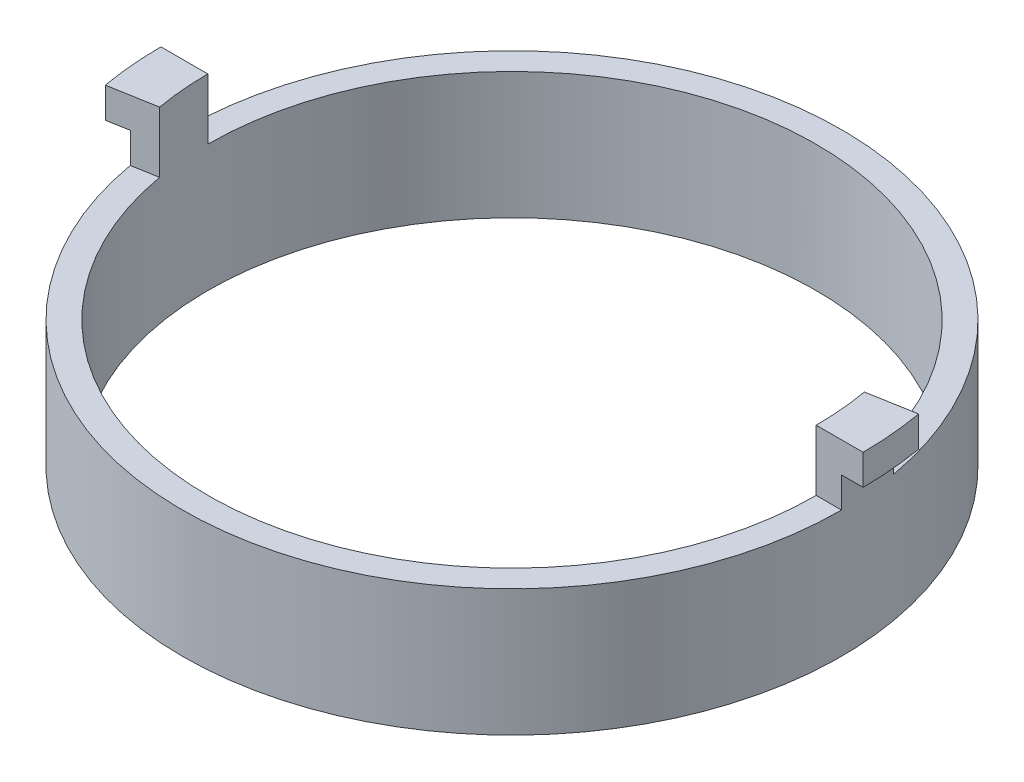
ISO-10303-21;
HEADER;
FILE_DESCRIPTION(('STEP AP214'),'2;1');
FILE_NAME('part.step','',(''),(''),'','','');
FILE_SCHEMA(('AUTOMOTIVE_DESIGN { 1 0 10303 214 1 1 1 1 }'));
ENDSEC;
DATA;
#1=APPLICATION_CONTEXT('core data for automotive mechanical design processes');
#2=APPLICATION_PROTOCOL_DEFINITION('international standard','automotive_design',2000,#1);
#3=PRODUCT_CONTEXT('',#1,'mechanical');
#4=PRODUCT('Part','Part','',(#3));
#5=PRODUCT_RELATED_PRODUCT_CATEGORY('part','',(#4));
#6=PRODUCT_DEFINITION_FORMATION('','',#4);
#7=PRODUCT_DEFINITION_CONTEXT('part definition',#1,'design');
#8=PRODUCT_DEFINITION('design','',#6,#7);
#9=PRODUCT_DEFINITION_SHAPE('','',#8);
#10=(LENGTH_UNIT() NAMED_UNIT(*) SI_UNIT(.MILLI.,.METRE.));
#11=(NAMED_UNIT(*) PLANE_ANGLE_UNIT() SI_UNIT($,.RADIAN.));
#12=(NAMED_UNIT(*) SI_UNIT($,.STERADIAN.) SOLID_ANGLE_UNIT());
#13=UNCERTAINTY_MEASURE_WITH_UNIT(LENGTH_MEASURE(1.E-05),#10,'distance_accuracy_value','');
#14=(GEOMETRIC_REPRESENTATION_CONTEXT(3) GLOBAL_UNCERTAINTY_ASSIGNED_CONTEXT((#13)) GLOBAL_UNIT_ASSIGNED_CONTEXT((#10,
#11,#12)) REPRESENTATION_CONTEXT('',''));
#15=CARTESIAN_POINT('',(0.,0.,0.));
#16=DIRECTION('',(0.,0.,1.));
#17=DIRECTION('',(1.,0.,0.));
#18=AXIS2_PLACEMENT_3D('',#15,#16,#17);
#19=CARTESIAN_POINT('',(0.,5.,0.));
#20=DIRECTION('',(0.,1.,0.));
#21=DIRECTION('',(0.,0.,1.));
#22=AXIS2_PLACEMENT_3D('',#19,#20,#21);
#23=PLANE('',#22);
#24=CARTESIAN_POINT('',(0.,5.,0.));
#25=DIRECTION('',(0.,1.,0.));
#26=DIRECTION('',(0.,0.,1.));
#27=AXIS2_PLACEMENT_3D('',#24,#25,#26);
#28=CIRCLE('',#27,12.);
#29=CARTESIAN_POINT('',(11.8176930361465,5.,-2.08377813200317));
#30=VERTEX_POINT('',#29);
#31=CARTESIAN_POINT('',(-12.,5.,0.));
#32=VERTEX_POINT('',#31);
#33=EDGE_CURVE('E59',#30,#32,#28,.T.);
#34=ORIENTED_EDGE('',*,*,#33,.F.);
#35=DIRECTION('',(-0.984807753012208,0.,0.173648177666931));
#36=VECTOR('',#35,1.);
#37=CARTESIAN_POINT('',(0.,5.,0.));
#38=LINE('',#37,#36);
#39=CARTESIAN_POINT('',(12.8025007891587,5.,-2.2574263096701));
#40=VERTEX_POINT('',#39);
#41=EDGE_CURVE('E206',#40,#30,#38,.T.);
#42=ORIENTED_EDGE('',*,*,#41,.F.);
#43=CARTESIAN_POINT('',(0.,5.,0.));
#44=DIRECTION('',(0.,1.,0.));
#45=DIRECTION('',(0.,0.,1.));
#46=AXIS2_PLACEMENT_3D('',#43,#44,#45);
#47=CIRCLE('',#46,13.);
#48=CARTESIAN_POINT('',(-13.,5.,0.));
#49=VERTEX_POINT('',#48);
#50=EDGE_CURVE('E47',#40,#49,#47,.T.);
#51=ORIENTED_EDGE('',*,*,#50,.T.);
#52=DIRECTION('',(1.,0.,0.));
#53=VECTOR('',#52,1.);
#54=CARTESIAN_POINT('',(0.,5.,0.));
#55=LINE('',#54,#53);
#56=EDGE_CURVE('E205',#49,#32,#55,.T.);
#57=ORIENTED_EDGE('',*,*,#56,.T.);
#58=EDGE_LOOP('',(#34,#42,#51,#57));
#59=FACE_BOUND('',#58,.T.);
#60=ADVANCED_FACE('F38',(#59),#23,.T.);
#61=DIRECTION('',(-1.,0.,0.));
#62=VECTOR('',#61,1.);
#63=CARTESIAN_POINT('',(0.,5.,0.));
#64=LINE('',#63,#62);
#65=CARTESIAN_POINT('',(13.,5.,0.));
#66=VERTEX_POINT('',#65);
#67=CARTESIAN_POINT('',(12.,5.,0.));
#68=VERTEX_POINT('',#67);
#69=EDGE_CURVE('E128',#66,#68,#64,.T.);
#70=ORIENTED_EDGE('',*,*,#69,.T.);
#71=CARTESIAN_POINT('',(-11.8176930361465,5.,2.08377813200317));
#72=VERTEX_POINT('',#71);
#73=EDGE_CURVE('E153',#72,#68,#28,.T.);
#74=ORIENTED_EDGE('',*,*,#73,.F.);
#75=DIRECTION('',(0.984807753012208,0.,-0.173648177666931));
#76=VECTOR('',#75,1.);
#77=CARTESIAN_POINT('',(0.,5.,0.));
#78=LINE('',#77,#76);
#79=CARTESIAN_POINT('',(-12.8025007891587,5.,2.2574263096701));
#80=VERTEX_POINT('',#79);
#81=EDGE_CURVE('E152',#80,#72,#78,.T.);
#82=ORIENTED_EDGE('',*,*,#81,.F.);
#83=EDGE_CURVE('E11',#80,#66,#47,.T.);
#84=ORIENTED_EDGE('',*,*,#83,.T.);
#85=EDGE_LOOP('',(#70,#74,#82,#84));
#86=FACE_BOUND('',#85,.T.);
#87=ADVANCED_FACE('F150',(#86),#23,.T.);
#88=CARTESIAN_POINT('',(0.,0.,0.));
#89=DIRECTION('',(0.,1.,0.));
#90=DIRECTION('',(0.,0.,1.));
#91=AXIS2_PLACEMENT_3D('',#88,#89,#90);
#92=PLANE('',#91);
#93=CARTESIAN_POINT('',(0.,0.,0.));
#94=DIRECTION('',(0.,1.,0.));
#95=DIRECTION('',(0.,0.,1.));
#96=AXIS2_PLACEMENT_3D('',#93,#94,#95);
#97=CIRCLE('',#96,13.);
#98=CARTESIAN_POINT('',(0.,0.,13.));
#99=VERTEX_POINT('',#98);
#100=EDGE_CURVE('E42',#99,#99,#97,.T.);
#101=ORIENTED_EDGE('',*,*,#100,.F.);
#102=EDGE_LOOP('',(#101));
#103=FACE_BOUND('',#102,.T.);
#104=CARTESIAN_POINT('',(0.,0.,0.));
#105=DIRECTION('',(0.,1.,0.));
#106=DIRECTION('',(0.,0.,1.));
#107=AXIS2_PLACEMENT_3D('',#104,#105,#106);
#108=CIRCLE('',#107,12.);
#109=CARTESIAN_POINT('',(0.,0.,12.));
#110=VERTEX_POINT('',#109);
#111=EDGE_CURVE('E170',#110,#110,#108,.T.);
#112=ORIENTED_EDGE('',*,*,#111,.T.);
#113=EDGE_LOOP('',(#112));
#114=FACE_BOUND('',#113,.T.);
#115=ADVANCED_FACE('F175',(#103,#114),#92,.F.);
#116=CARTESIAN_POINT('',(0.,5.,0.));
#117=DIRECTION('',(0.,-1.,0.));
#118=DIRECTION('',(0.,0.,-1.));
#119=AXIS2_PLACEMENT_3D('',#116,#117,#118);
#120=CYLINDRICAL_SURFACE('',#119,13.);
#121=ORIENTED_EDGE('',*,*,#83,.F.);
#122=DIRECTION('',(0.,-1.,0.));
#123=VECTOR('',#122,1.);
#124=CARTESIAN_POINT('',(-12.8025007891587,0.,2.2574263096701));
#125=LINE('',#124,#123);
#126=CARTESIAN_POINT('',(-12.8025007891587,6.2,2.2574263096701));
#127=VERTEX_POINT('',#126);
#128=EDGE_CURVE('E157',#127,#80,#125,.T.);
#129=ORIENTED_EDGE('',*,*,#128,.F.);
#130=CARTESIAN_POINT('',(0.,6.2,0.));
#131=DIRECTION('',(0.,-1.,0.));
#132=DIRECTION('',(0.,0.,-1.));
#133=AXIS2_PLACEMENT_3D('',#130,#131,#132);
#134=CIRCLE('',#133,13.);
#135=CARTESIAN_POINT('',(-13.,6.2,0.));
#136=VERTEX_POINT('',#135);
#137=EDGE_CURVE('E156',#127,#136,#134,.T.);
#138=ORIENTED_EDGE('',*,*,#137,.T.);
#139=DIRECTION('',(0.,-1.,0.));
#140=VECTOR('',#139,1.);
#141=CARTESIAN_POINT('',(-13.,0.,0.));
#142=LINE('',#141,#140);
#143=EDGE_CURVE('E208',#136,#49,#142,.T.);
#144=ORIENTED_EDGE('',*,*,#143,.T.);
#145=ORIENTED_EDGE('',*,*,#50,.F.);
#146=DIRECTION('',(0.,-1.,0.));
#147=VECTOR('',#146,1.);
#148=CARTESIAN_POINT('',(12.8025007891587,0.,-2.2574263096701));
#149=LINE('',#148,#147);
#150=CARTESIAN_POINT('',(12.8025007891587,6.2,-2.2574263096701));
#151=VERTEX_POINT('',#150);
#152=EDGE_CURVE('E259',#151,#40,#149,.T.);
#153=ORIENTED_EDGE('',*,*,#152,.F.);
#154=CARTESIAN_POINT('',(0.,6.2,0.));
#155=DIRECTION('',(0.,-1.,0.));
#156=DIRECTION('',(0.,0.,-1.));
#157=AXIS2_PLACEMENT_3D('',#154,#155,#156);
#158=CIRCLE('',#157,13.);
#159=CARTESIAN_POINT('',(13.,6.2,0.));
#160=VERTEX_POINT('',#159);
#161=EDGE_CURVE('E146',#151,#160,#158,.T.);
#162=ORIENTED_EDGE('',*,*,#161,.T.);
#163=DIRECTION('',(0.,-1.,0.));
#164=VECTOR('',#163,1.);
#165=CARTESIAN_POINT('',(13.,0.,0.));
#166=LINE('',#165,#164);
#167=EDGE_CURVE('E132',#160,#66,#166,.T.);
#168=ORIENTED_EDGE('',*,*,#167,.T.);
#169=EDGE_LOOP('',(#121,#129,#138,#144,#145,#153,#162,#168));
#170=FACE_BOUND('',#169,.T.);
#171=ORIENTED_EDGE('',*,*,#100,.T.);
#172=EDGE_LOOP('',(#171));
#173=FACE_BOUND('',#172,.T.);
#174=ADVANCED_FACE('F40',(#170,#173),#120,.T.);
#175=CARTESIAN_POINT('',(0.,5.,0.));
#176=DIRECTION('',(0.,-1.,0.));
#177=DIRECTION('',(0.,0.,-1.));
#178=AXIS2_PLACEMENT_3D('',#175,#176,#177);
#179=CYLINDRICAL_SURFACE('',#178,12.);
#180=ORIENTED_EDGE('',*,*,#73,.T.);
#181=DIRECTION('',(0.,1.,0.));
#182=VECTOR('',#181,1.);
#183=CARTESIAN_POINT('',(12.,0.,0.));
#184=LINE('',#183,#182);
#185=CARTESIAN_POINT('',(12.,7.4,0.));
#186=VERTEX_POINT('',#185);
#187=EDGE_CURVE('E136',#68,#186,#184,.T.);
#188=ORIENTED_EDGE('',*,*,#187,.T.);
#189=CARTESIAN_POINT('',(0.,7.4,0.));
#190=DIRECTION('',(0.,-1.,0.));
#191=DIRECTION('',(0.,0.,-1.));
#192=AXIS2_PLACEMENT_3D('',#189,#190,#191);
#193=CIRCLE('',#192,12.);
#194=CARTESIAN_POINT('',(11.8176930361465,7.4,-2.08377813200317));
#195=VERTEX_POINT('',#194);
#196=EDGE_CURVE('E247',#195,#186,#193,.T.);
#197=ORIENTED_EDGE('',*,*,#196,.F.);
#198=DIRECTION('',(0.,1.,0.));
#199=VECTOR('',#198,1.);
#200=CARTESIAN_POINT('',(11.8176930361465,0.,-2.08377813200317));
#201=LINE('',#200,#199);
#202=EDGE_CURVE('E54',#30,#195,#201,.T.);
#203=ORIENTED_EDGE('',*,*,#202,.F.);
#204=ORIENTED_EDGE('',*,*,#33,.T.);
#205=DIRECTION('',(0.,1.,0.));
#206=VECTOR('',#205,1.);
#207=CARTESIAN_POINT('',(-12.,0.,0.));
#208=LINE('',#207,#206);
#209=CARTESIAN_POINT('',(-12.,7.4,0.));
#210=VERTEX_POINT('',#209);
#211=EDGE_CURVE('E216',#32,#210,#208,.T.);
#212=ORIENTED_EDGE('',*,*,#211,.T.);
#213=CARTESIAN_POINT('',(0.,7.4,0.));
#214=DIRECTION('',(0.,-1.,0.));
#215=DIRECTION('',(0.,0.,-1.));
#216=AXIS2_PLACEMENT_3D('',#213,#214,#215);
#217=CIRCLE('',#216,12.);
#218=CARTESIAN_POINT('',(-11.8176930361465,7.4,2.08377813200317));
#219=VERTEX_POINT('',#218);
#220=EDGE_CURVE('E168',#219,#210,#217,.T.);
#221=ORIENTED_EDGE('',*,*,#220,.F.);
#222=DIRECTION('',(0.,1.,0.));
#223=VECTOR('',#222,1.);
#224=CARTESIAN_POINT('',(-11.8176930361465,0.,2.08377813200317));
#225=LINE('',#224,#223);
#226=EDGE_CURVE('E217',#72,#219,#225,.T.);
#227=ORIENTED_EDGE('',*,*,#226,.F.);
#228=EDGE_LOOP('',(#180,#188,#197,#203,#204,#212,#221,#227));
#229=FACE_BOUND('',#228,.T.);
#230=ORIENTED_EDGE('',*,*,#111,.F.);
#231=EDGE_LOOP('',(#230));
#232=FACE_BOUND('',#231,.T.);
#233=ADVANCED_FACE('F177',(#229,#232),#179,.F.);
#234=CARTESIAN_POINT('',(0.,7.4,0.));
#235=DIRECTION('',(0.,-1.,0.));
#236=DIRECTION('',(0.,0.,-1.));
#237=AXIS2_PLACEMENT_3D('',#234,#235,#236);
#238=PLANE('',#237);
#239=CARTESIAN_POINT('',(0.,7.4,0.));
#240=DIRECTION('',(0.,-1.,0.));
#241=DIRECTION('',(0.,0.,-1.));
#242=AXIS2_PLACEMENT_3D('',#239,#240,#241);
#243=CIRCLE('',#242,13.85);
#244=CARTESIAN_POINT('',(-13.6395873792191,7.4,2.40502726068699));
#245=VERTEX_POINT('',#244);
#246=CARTESIAN_POINT('',(-13.85,7.4,0.));
#247=VERTEX_POINT('',#246);
#248=EDGE_CURVE('E166',#245,#247,#243,.T.);
#249=ORIENTED_EDGE('',*,*,#248,.F.);
#250=DIRECTION('',(-0.984807753012208,0.,0.173648177666931));
#251=VECTOR('',#250,1.);
#252=CARTESIAN_POINT('',(0.,7.4,0.));
#253=LINE('',#252,#251);
#254=EDGE_CURVE('E219',#219,#245,#253,.T.);
#255=ORIENTED_EDGE('',*,*,#254,.F.);
#256=ORIENTED_EDGE('',*,*,#220,.T.);
#257=DIRECTION('',(-1.,0.,0.));
#258=VECTOR('',#257,1.);
#259=CARTESIAN_POINT('',(0.,7.4,0.));
#260=LINE('',#259,#258);
#261=EDGE_CURVE('E236',#210,#247,#260,.T.);
#262=ORIENTED_EDGE('',*,*,#261,.T.);
#263=EDGE_LOOP('',(#249,#255,#256,#262));
#264=FACE_BOUND('',#263,.T.);
#265=ADVANCED_FACE('F179',(#264),#238,.F.);
#266=CARTESIAN_POINT('',(0.,0.,0.));
#267=DIRECTION('',(0.,-1.,0.));
#268=DIRECTION('',(0.,0.,-1.));
#269=AXIS2_PLACEMENT_3D('',#266,#267,#268);
#270=CYLINDRICAL_SURFACE('',#269,13.85);
#271=CARTESIAN_POINT('',(0.,6.2,0.));
#272=DIRECTION('',(0.,-1.,0.));
#273=DIRECTION('',(0.,0.,-1.));
#274=AXIS2_PLACEMENT_3D('',#271,#272,#273);
#275=CIRCLE('',#274,13.85);
#276=CARTESIAN_POINT('',(-13.6395873792191,6.2,2.40502726068699));
#277=VERTEX_POINT('',#276);
#278=CARTESIAN_POINT('',(-13.85,6.2,0.));
#279=VERTEX_POINT('',#278);
#280=EDGE_CURVE('E159',#277,#279,#275,.T.);
#281=ORIENTED_EDGE('',*,*,#280,.F.);
#282=DIRECTION('',(0.,-1.,0.));
#283=VECTOR('',#282,1.);
#284=CARTESIAN_POINT('',(-13.6395873792191,0.,2.40502726068699));
#285=LINE('',#284,#283);
#286=EDGE_CURVE('E225',#245,#277,#285,.T.);
#287=ORIENTED_EDGE('',*,*,#286,.F.);
#288=ORIENTED_EDGE('',*,*,#248,.T.);
#289=DIRECTION('',(0.,-1.,0.));
#290=VECTOR('',#289,1.);
#291=CARTESIAN_POINT('',(-13.85,0.,0.));
#292=LINE('',#291,#290);
#293=EDGE_CURVE('E235',#247,#279,#292,.T.);
#294=ORIENTED_EDGE('',*,*,#293,.T.);
#295=EDGE_LOOP('',(#281,#287,#288,#294));
#296=FACE_BOUND('',#295,.T.);
#297=ADVANCED_FACE('F185',(#296),#270,.T.);
#298=CARTESIAN_POINT('',(0.,6.2,0.));
#299=DIRECTION('',(0.,1.,0.));
#300=DIRECTION('',(0.,0.,1.));
#301=AXIS2_PLACEMENT_3D('',#298,#299,#300);
#302=PLANE('',#301);
#303=ORIENTED_EDGE('',*,*,#137,.F.);
#304=DIRECTION('',(0.984807753012208,0.,-0.173648177666931));
#305=VECTOR('',#304,1.);
#306=CARTESIAN_POINT('',(0.,6.2,0.));
#307=LINE('',#306,#305);
#308=EDGE_CURVE('E161',#277,#127,#307,.T.);
#309=ORIENTED_EDGE('',*,*,#308,.F.);
#310=ORIENTED_EDGE('',*,*,#280,.T.);
#311=DIRECTION('',(1.,0.,0.));
#312=VECTOR('',#311,1.);
#313=CARTESIAN_POINT('',(0.,6.2,0.));
#314=LINE('',#313,#312);
#315=EDGE_CURVE('E212',#279,#136,#314,.T.);
#316=ORIENTED_EDGE('',*,*,#315,.T.);
#317=EDGE_LOOP('',(#303,#309,#310,#316));
#318=FACE_BOUND('',#317,.T.);
#319=ADVANCED_FACE('F232',(#318),#302,.F.);
#320=CARTESIAN_POINT('',(0.,0.,0.));
#321=DIRECTION('',(0.173648177666931,0.,0.984807753012208));
#322=DIRECTION('',(0.984807753012208,0.,-0.173648177666931));
#323=AXIS2_PLACEMENT_3D('',#320,#321,#322);
#324=PLANE('',#323);
#325=ORIENTED_EDGE('',*,*,#226,.T.);
#326=ORIENTED_EDGE('',*,*,#254,.T.);
#327=ORIENTED_EDGE('',*,*,#286,.T.);
#328=ORIENTED_EDGE('',*,*,#308,.T.);
#329=ORIENTED_EDGE('',*,*,#128,.T.);
#330=ORIENTED_EDGE('',*,*,#81,.T.);
#331=EDGE_LOOP('',(#325,#326,#327,#328,#329,#330));
#332=FACE_BOUND('',#331,.T.);
#333=ADVANCED_FACE('F229',(#332),#324,.T.);
#334=CARTESIAN_POINT('',(0.,0.,0.));
#335=DIRECTION('',(0.,0.,1.));
#336=DIRECTION('',(1.,0.,0.));
#337=AXIS2_PLACEMENT_3D('',#334,#335,#336);
#338=PLANE('',#337);
#339=ORIENTED_EDGE('',*,*,#211,.F.);
#340=ORIENTED_EDGE('',*,*,#56,.F.);
#341=ORIENTED_EDGE('',*,*,#143,.F.);
#342=ORIENTED_EDGE('',*,*,#315,.F.);
#343=ORIENTED_EDGE('',*,*,#293,.F.);
#344=ORIENTED_EDGE('',*,*,#261,.F.);
#345=EDGE_LOOP('',(#339,#340,#341,#342,#343,#344));
#346=FACE_BOUND('',#345,.T.);
#347=ADVANCED_FACE('F214',(#346),#338,.F.);
#348=CARTESIAN_POINT('',(0.,6.2,0.));
#349=DIRECTION('',(0.,1.,0.));
#350=DIRECTION('',(0.,0.,1.));
#351=AXIS2_PLACEMENT_3D('',#348,#349,#350);
#352=PLANE('',#351);
#353=CARTESIAN_POINT('',(0.,6.2,0.));
#354=DIRECTION('',(0.,-1.,0.));
#355=DIRECTION('',(0.,0.,-1.));
#356=AXIS2_PLACEMENT_3D('',#353,#354,#355);
#357=CIRCLE('',#356,13.85);
#358=CARTESIAN_POINT('',(13.6395873792191,6.2,-2.40502726068699));
#359=VERTEX_POINT('',#358);
#360=CARTESIAN_POINT('',(13.85,6.2,0.));
#361=VERTEX_POINT('',#360);
#362=EDGE_CURVE('E243',#359,#361,#357,.T.);
#363=ORIENTED_EDGE('',*,*,#362,.T.);
#364=DIRECTION('',(-1.,0.,0.));
#365=VECTOR('',#364,1.);
#366=CARTESIAN_POINT('',(0.,6.2,0.));
#367=LINE('',#366,#365);
#368=EDGE_CURVE('E147',#361,#160,#367,.T.);
#369=ORIENTED_EDGE('',*,*,#368,.T.);
#370=ORIENTED_EDGE('',*,*,#161,.F.);
#371=DIRECTION('',(-0.984807753012208,0.,0.173648177666931));
#372=VECTOR('',#371,1.);
#373=CARTESIAN_POINT('',(0.,6.2,0.));
#374=LINE('',#373,#372);
#375=EDGE_CURVE('E256',#359,#151,#374,.T.);
#376=ORIENTED_EDGE('',*,*,#375,.F.);
#377=EDGE_LOOP('',(#363,#369,#370,#376));
#378=FACE_BOUND('',#377,.T.);
#379=ADVANCED_FACE('F270',(#378),#352,.F.);
#380=CARTESIAN_POINT('',(0.,0.,0.));
#381=DIRECTION('',(0.,-1.,0.));
#382=DIRECTION('',(0.,0.,-1.));
#383=AXIS2_PLACEMENT_3D('',#380,#381,#382);
#384=CYLINDRICAL_SURFACE('',#383,13.85);
#385=CARTESIAN_POINT('',(0.,7.4,0.));
#386=DIRECTION('',(0.,-1.,0.));
#387=DIRECTION('',(0.,0.,-1.));
#388=AXIS2_PLACEMENT_3D('',#385,#386,#387);
#389=CIRCLE('',#388,13.85);
#390=CARTESIAN_POINT('',(13.6395873792191,7.4,-2.40502726068699));
#391=VERTEX_POINT('',#390);
#392=CARTESIAN_POINT('',(13.85,7.4,0.));
#393=VERTEX_POINT('',#392);
#394=EDGE_CURVE('E245',#391,#393,#389,.T.);
#395=ORIENTED_EDGE('',*,*,#394,.T.);
#396=DIRECTION('',(0.,-1.,0.));
#397=VECTOR('',#396,1.);
#398=CARTESIAN_POINT('',(13.85,0.,0.));
#399=LINE('',#398,#397);
#400=EDGE_CURVE('E266',#393,#361,#399,.T.);
#401=ORIENTED_EDGE('',*,*,#400,.T.);
#402=ORIENTED_EDGE('',*,*,#362,.F.);
#403=DIRECTION('',(0.,-1.,0.));
#404=VECTOR('',#403,1.);
#405=CARTESIAN_POINT('',(13.6395873792191,0.,-2.40502726068699));
#406=LINE('',#405,#404);
#407=EDGE_CURVE('E253',#391,#359,#406,.T.);
#408=ORIENTED_EDGE('',*,*,#407,.F.);
#409=EDGE_LOOP('',(#395,#401,#402,#408));
#410=FACE_BOUND('',#409,.T.);
#411=ADVANCED_FACE('F274',(#410),#384,.T.);
#412=CARTESIAN_POINT('',(0.,7.4,0.));
#413=DIRECTION('',(0.,-1.,0.));
#414=DIRECTION('',(0.,0.,-1.));
#415=AXIS2_PLACEMENT_3D('',#412,#413,#414);
#416=PLANE('',#415);
#417=ORIENTED_EDGE('',*,*,#196,.T.);
#418=DIRECTION('',(1.,0.,0.));
#419=VECTOR('',#418,1.);
#420=CARTESIAN_POINT('',(0.,7.4,0.));
#421=LINE('',#420,#419);
#422=EDGE_CURVE('E263',#186,#393,#421,.T.);
#423=ORIENTED_EDGE('',*,*,#422,.T.);
#424=ORIENTED_EDGE('',*,*,#394,.F.);
#425=DIRECTION('',(0.984807753012208,0.,-0.173648177666931));
#426=VECTOR('',#425,1.);
#427=CARTESIAN_POINT('',(0.,7.4,0.));
#428=LINE('',#427,#426);
#429=EDGE_CURVE('E250',#195,#391,#428,.T.);
#430=ORIENTED_EDGE('',*,*,#429,.F.);
#431=EDGE_LOOP('',(#417,#423,#424,#430));
#432=FACE_BOUND('',#431,.T.);
#433=ADVANCED_FACE('F278',(#432),#416,.F.);
#434=CARTESIAN_POINT('',(0.,0.,0.));
#435=DIRECTION('',(0.173648177666931,0.,0.984807753012208));
#436=DIRECTION('',(0.984807753012208,0.,-0.173648177666931));
#437=AXIS2_PLACEMENT_3D('',#434,#435,#436);
#438=PLANE('',#437);
#439=ORIENTED_EDGE('',*,*,#41,.T.);
#440=ORIENTED_EDGE('',*,*,#202,.T.);
#441=ORIENTED_EDGE('',*,*,#429,.T.);
#442=ORIENTED_EDGE('',*,*,#407,.T.);
#443=ORIENTED_EDGE('',*,*,#375,.T.);
#444=ORIENTED_EDGE('',*,*,#152,.T.);
#445=EDGE_LOOP('',(#439,#440,#441,#442,#443,#444));
#446=FACE_BOUND('',#445,.T.);
#447=ADVANCED_FACE('F298',(#446),#438,.F.);
#448=CARTESIAN_POINT('',(0.,0.,0.));
#449=DIRECTION('',(0.,0.,1.));
#450=DIRECTION('',(1.,0.,0.));
#451=AXIS2_PLACEMENT_3D('',#448,#449,#450);
#452=PLANE('',#451);
#453=ORIENTED_EDGE('',*,*,#69,.F.);
#454=ORIENTED_EDGE('',*,*,#167,.F.);
#455=ORIENTED_EDGE('',*,*,#368,.F.);
#456=ORIENTED_EDGE('',*,*,#400,.F.);
#457=ORIENTED_EDGE('',*,*,#422,.F.);
#458=ORIENTED_EDGE('',*,*,#187,.F.);
#459=EDGE_LOOP('',(#453,#454,#455,#456,#457,#458));
#460=FACE_BOUND('',#459,.T.);
#461=ADVANCED_FACE('F130',(#460),#452,.T.);
#462=CLOSED_SHELL('',(#60,#87,#115,#174,#233,#265,#297,#319,#333,#347,#379,#411,#433,#447,#461));
#463=MANIFOLD_SOLID_BREP('B2',#462);
#464=ADVANCED_BREP_SHAPE_REPRESENTATION('',(#18,#463),#14);
#465=SHAPE_DEFINITION_REPRESENTATION(#9,#464);
ENDSEC;
END-ISO-10303-21;
